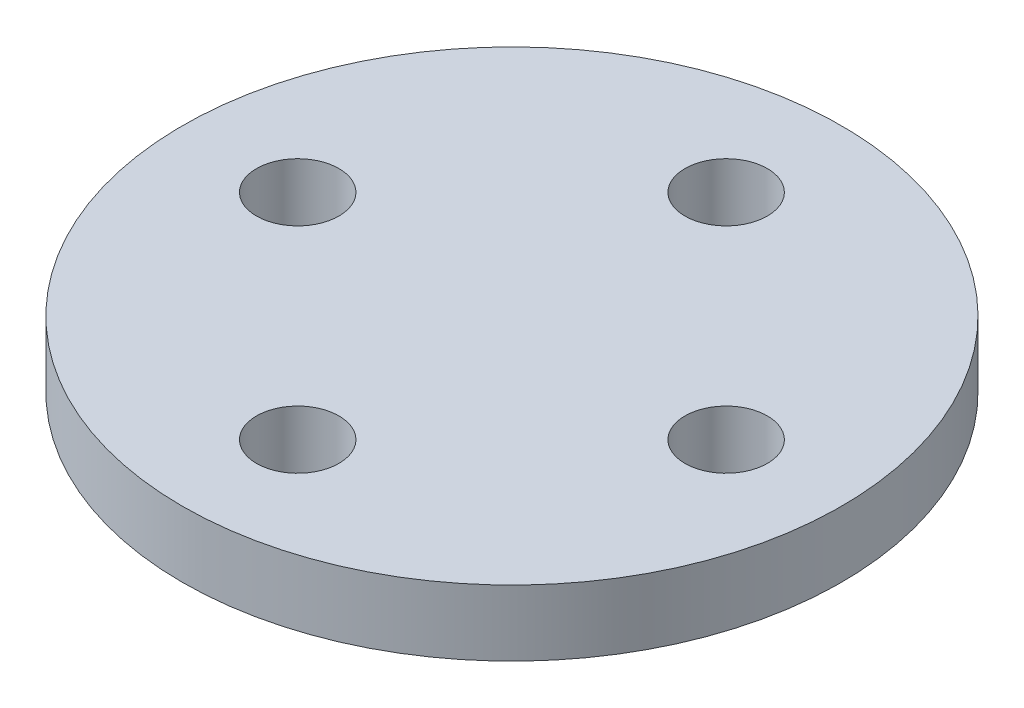
ISO-10303-21;
HEADER;
FILE_DESCRIPTION(('STEP AP214'),'2;1');
FILE_NAME('part.step','',(''),(''),'','','');
FILE_SCHEMA(('AUTOMOTIVE_DESIGN { 1 0 10303 214 1 1 1 1 }'));
ENDSEC;
DATA;
#1=APPLICATION_CONTEXT('core data for automotive mechanical design processes');
#2=APPLICATION_PROTOCOL_DEFINITION('international standard','automotive_design',2000,#1);
#3=PRODUCT_CONTEXT('',#1,'mechanical');
#4=PRODUCT('Part','Part','',(#3));
#5=PRODUCT_RELATED_PRODUCT_CATEGORY('part','',(#4));
#6=PRODUCT_DEFINITION_FORMATION('','',#4);
#7=PRODUCT_DEFINITION_CONTEXT('part definition',#1,'design');
#8=PRODUCT_DEFINITION('design','',#6,#7);
#9=PRODUCT_DEFINITION_SHAPE('','',#8);
#10=(LENGTH_UNIT() NAMED_UNIT(*) SI_UNIT(.MILLI.,.METRE.));
#11=(NAMED_UNIT(*) PLANE_ANGLE_UNIT() SI_UNIT($,.RADIAN.));
#12=(NAMED_UNIT(*) SI_UNIT($,.STERADIAN.) SOLID_ANGLE_UNIT());
#13=UNCERTAINTY_MEASURE_WITH_UNIT(LENGTH_MEASURE(1.E-05),#10,'distance_accuracy_value','');
#14=(GEOMETRIC_REPRESENTATION_CONTEXT(3) GLOBAL_UNCERTAINTY_ASSIGNED_CONTEXT((#13)) GLOBAL_UNIT_ASSIGNED_CONTEXT((#10,
#11,#12)) REPRESENTATION_CONTEXT('',''));
#15=CARTESIAN_POINT('',(0.,0.,0.));
#16=DIRECTION('',(0.,0.,1.));
#17=DIRECTION('',(1.,0.,0.));
#18=AXIS2_PLACEMENT_3D('',#15,#16,#17);
#19=CARTESIAN_POINT('',(0.,2.,0.));
#20=DIRECTION('',(0.,1.,0.));
#21=DIRECTION('',(0.,0.,1.));
#22=AXIS2_PLACEMENT_3D('',#19,#20,#21);
#23=PLANE('',#22);
#24=CARTESIAN_POINT('',(-2.8796409701215E-13,2.,6.50000000000009));
#25=DIRECTION('',(0.,1.,0.));
#26=DIRECTION('',(0.,0.,1.));
#27=AXIS2_PLACEMENT_3D('',#24,#25,#26);
#28=CIRCLE('',#27,1.24999999999974);
#29=CARTESIAN_POINT('',(-2.8796409701215E-13,2.,7.74999999999983));
#30=VERTEX_POINT('',#29);
#31=EDGE_CURVE('E61',#30,#30,#28,.T.);
#32=ORIENTED_EDGE('',*,*,#31,.F.);
#33=EDGE_LOOP('',(#32));
#34=FACE_BOUND('',#33,.T.);
#35=CARTESIAN_POINT('',(0.,2.,-6.5));
#36=DIRECTION('',(0.,1.,0.));
#37=DIRECTION('',(0.,0.,1.));
#38=AXIS2_PLACEMENT_3D('',#35,#36,#37);
#39=CIRCLE('',#38,1.25);
#40=CARTESIAN_POINT('',(0.,2.,-5.25));
#41=VERTEX_POINT('',#40);
#42=EDGE_CURVE('E73',#41,#41,#39,.T.);
#43=ORIENTED_EDGE('',*,*,#42,.F.);
#44=EDGE_LOOP('',(#43));
#45=FACE_BOUND('',#44,.T.);
#46=CARTESIAN_POINT('',(0.,2.,0.));
#47=DIRECTION('',(0.,1.,0.));
#48=DIRECTION('',(0.,0.,1.));
#49=AXIS2_PLACEMENT_3D('',#46,#47,#48);
#50=CIRCLE('',#49,10.);
#51=CARTESIAN_POINT('',(0.,2.,10.));
#52=VERTEX_POINT('',#51);
#53=EDGE_CURVE('E45',#52,#52,#50,.T.);
#54=ORIENTED_EDGE('',*,*,#53,.T.);
#55=EDGE_LOOP('',(#54));
#56=FACE_BOUND('',#55,.T.);
#57=CARTESIAN_POINT('',(6.49999999999971,2.,0.));
#58=DIRECTION('',(0.,1.,0.));
#59=DIRECTION('',(0.,0.,1.));
#60=AXIS2_PLACEMENT_3D('',#57,#58,#59);
#61=CIRCLE('',#60,1.25000000000002);
#62=CARTESIAN_POINT('',(6.49999999999971,2.,1.25000000000011));
#63=VERTEX_POINT('',#62);
#64=EDGE_CURVE('E67',#63,#63,#61,.T.);
#65=ORIENTED_EDGE('',*,*,#64,.F.);
#66=EDGE_LOOP('',(#65));
#67=FACE_BOUND('',#66,.T.);
#68=CARTESIAN_POINT('',(-6.5,2.,3.68853642922431E-13));
#69=DIRECTION('',(0.,1.,0.));
#70=DIRECTION('',(0.,0.,1.));
#71=AXIS2_PLACEMENT_3D('',#68,#69,#70);
#72=CIRCLE('',#71,1.25000000000042);
#73=CARTESIAN_POINT('',(-6.5,2.,1.25000000000079));
#74=VERTEX_POINT('',#73);
#75=EDGE_CURVE('E54',#74,#74,#72,.T.);
#76=ORIENTED_EDGE('',*,*,#75,.F.);
#77=EDGE_LOOP('',(#76));
#78=FACE_BOUND('',#77,.T.);
#79=ADVANCED_FACE('F37',(#34,#45,#56,#67,#78),#23,.T.);
#80=CARTESIAN_POINT('',(0.,0.,0.));
#81=DIRECTION('',(0.,1.,0.));
#82=DIRECTION('',(0.,0.,1.));
#83=AXIS2_PLACEMENT_3D('',#80,#81,#82);
#84=PLANE('',#83);
#85=CARTESIAN_POINT('',(0.,0.,0.));
#86=DIRECTION('',(0.,-1.,0.));
#87=DIRECTION('',(0.,0.,-1.));
#88=AXIS2_PLACEMENT_3D('',#85,#86,#87);
#89=CIRCLE('',#88,4.5);
#90=CARTESIAN_POINT('',(0.,0.,-4.5));
#91=VERTEX_POINT('',#90);
#92=EDGE_CURVE('E10',#91,#91,#89,.T.);
#93=ORIENTED_EDGE('',*,*,#92,.F.);
#94=EDGE_LOOP('',(#93));
#95=FACE_BOUND('',#94,.T.);
#96=CARTESIAN_POINT('',(0.,0.,0.));
#97=DIRECTION('',(0.,1.,0.));
#98=DIRECTION('',(0.,0.,1.));
#99=AXIS2_PLACEMENT_3D('',#96,#97,#98);
#100=CIRCLE('',#99,10.);
#101=CARTESIAN_POINT('',(0.,0.,10.));
#102=VERTEX_POINT('',#101);
#103=EDGE_CURVE('E41',#102,#102,#100,.T.);
#104=ORIENTED_EDGE('',*,*,#103,.F.);
#105=EDGE_LOOP('',(#104));
#106=FACE_BOUND('',#105,.T.);
#107=CARTESIAN_POINT('',(0.,0.,-6.5));
#108=DIRECTION('',(0.,1.,0.));
#109=DIRECTION('',(0.,0.,1.));
#110=AXIS2_PLACEMENT_3D('',#107,#108,#109);
#111=CIRCLE('',#110,1.25);
#112=CARTESIAN_POINT('',(0.,0.,-5.25));
#113=VERTEX_POINT('',#112);
#114=EDGE_CURVE('E70',#113,#113,#111,.T.);
#115=ORIENTED_EDGE('',*,*,#114,.T.);
#116=EDGE_LOOP('',(#115));
#117=FACE_BOUND('',#116,.T.);
#118=CARTESIAN_POINT('',(6.49999999999971,0.,0.));
#119=DIRECTION('',(0.,1.,0.));
#120=DIRECTION('',(0.,0.,1.));
#121=AXIS2_PLACEMENT_3D('',#118,#119,#120);
#122=CIRCLE('',#121,1.25000000000002);
#123=CARTESIAN_POINT('',(6.49999999999971,0.,1.25000000000011));
#124=VERTEX_POINT('',#123);
#125=EDGE_CURVE('E64',#124,#124,#122,.T.);
#126=ORIENTED_EDGE('',*,*,#125,.T.);
#127=EDGE_LOOP('',(#126));
#128=FACE_BOUND('',#127,.T.);
#129=CARTESIAN_POINT('',(-2.8796409701215E-13,0.,6.50000000000009));
#130=DIRECTION('',(0.,1.,0.));
#131=DIRECTION('',(0.,0.,1.));
#132=AXIS2_PLACEMENT_3D('',#129,#130,#131);
#133=CIRCLE('',#132,1.24999999999974);
#134=CARTESIAN_POINT('',(-2.8796409701215E-13,0.,7.74999999999983));
#135=VERTEX_POINT('',#134);
#136=EDGE_CURVE('E57',#135,#135,#133,.T.);
#137=ORIENTED_EDGE('',*,*,#136,.T.);
#138=EDGE_LOOP('',(#137));
#139=FACE_BOUND('',#138,.T.);
#140=CARTESIAN_POINT('',(-6.5,0.,3.68853642922431E-13));
#141=DIRECTION('',(0.,1.,0.));
#142=DIRECTION('',(0.,0.,1.));
#143=AXIS2_PLACEMENT_3D('',#140,#141,#142);
#144=CIRCLE('',#143,1.25000000000042);
#145=CARTESIAN_POINT('',(-6.5,0.,1.25000000000079));
#146=VERTEX_POINT('',#145);
#147=EDGE_CURVE('E58',#146,#146,#144,.T.);
#148=ORIENTED_EDGE('',*,*,#147,.T.);
#149=EDGE_LOOP('',(#148));
#150=FACE_BOUND('',#149,.T.);
#151=ADVANCED_FACE('F79',(#95,#106,#117,#128,#139,#150),#84,.F.);
#152=CARTESIAN_POINT('',(0.,2.,0.));
#153=DIRECTION('',(0.,-1.,0.));
#154=DIRECTION('',(0.,0.,-1.));
#155=AXIS2_PLACEMENT_3D('',#152,#153,#154);
#156=CYLINDRICAL_SURFACE('',#155,10.);
#157=ORIENTED_EDGE('',*,*,#53,.F.);
#158=EDGE_LOOP('',(#157));
#159=FACE_BOUND('',#158,.T.);
#160=ORIENTED_EDGE('',*,*,#103,.T.);
#161=EDGE_LOOP('',(#160));
#162=FACE_BOUND('',#161,.T.);
#163=ADVANCED_FACE('F39',(#159,#162),#156,.T.);
#164=CARTESIAN_POINT('',(0.,2.,-6.5));
#165=DIRECTION('',(0.,-1.,0.));
#166=DIRECTION('',(0.,0.,-1.));
#167=AXIS2_PLACEMENT_3D('',#164,#165,#166);
#168=CYLINDRICAL_SURFACE('',#167,1.25);
#169=ORIENTED_EDGE('',*,*,#42,.T.);
#170=EDGE_LOOP('',(#169));
#171=FACE_BOUND('',#170,.T.);
#172=ORIENTED_EDGE('',*,*,#114,.F.);
#173=EDGE_LOOP('',(#172));
#174=FACE_BOUND('',#173,.T.);
#175=ADVANCED_FACE('F82',(#171,#174),#168,.F.);
#176=CARTESIAN_POINT('',(6.49999999999971,2.,0.));
#177=DIRECTION('',(0.,-1.,0.));
#178=DIRECTION('',(0.,0.,-1.));
#179=AXIS2_PLACEMENT_3D('',#176,#177,#178);
#180=CYLINDRICAL_SURFACE('',#179,1.25000000000002);
#181=ORIENTED_EDGE('',*,*,#64,.T.);
#182=EDGE_LOOP('',(#181));
#183=FACE_BOUND('',#182,.T.);
#184=ORIENTED_EDGE('',*,*,#125,.F.);
#185=EDGE_LOOP('',(#184));
#186=FACE_BOUND('',#185,.T.);
#187=ADVANCED_FACE('F84',(#183,#186),#180,.F.);
#188=CARTESIAN_POINT('',(-2.8796409701215E-13,2.,6.50000000000009));
#189=DIRECTION('',(0.,-1.,0.));
#190=DIRECTION('',(0.,0.,-1.));
#191=AXIS2_PLACEMENT_3D('',#188,#189,#190);
#192=CYLINDRICAL_SURFACE('',#191,1.24999999999974);
#193=ORIENTED_EDGE('',*,*,#31,.T.);
#194=EDGE_LOOP('',(#193));
#195=FACE_BOUND('',#194,.T.);
#196=ORIENTED_EDGE('',*,*,#136,.F.);
#197=EDGE_LOOP('',(#196));
#198=FACE_BOUND('',#197,.T.);
#199=ADVANCED_FACE('F91',(#195,#198),#192,.F.);
#200=CARTESIAN_POINT('',(-6.5,2.,3.68853642922431E-13));
#201=DIRECTION('',(0.,-1.,0.));
#202=DIRECTION('',(0.,0.,-1.));
#203=AXIS2_PLACEMENT_3D('',#200,#201,#202);
#204=CYLINDRICAL_SURFACE('',#203,1.25000000000042);
#205=ORIENTED_EDGE('',*,*,#75,.T.);
#206=EDGE_LOOP('',(#205));
#207=FACE_BOUND('',#206,.T.);
#208=ORIENTED_EDGE('',*,*,#147,.F.);
#209=EDGE_LOOP('',(#208));
#210=FACE_BOUND('',#209,.T.);
#211=ADVANCED_FACE('F112',(#207,#210),#204,.F.);
#212=CARTESIAN_POINT('',(0.,-2.,0.));
#213=DIRECTION('',(0.,1.,0.));
#214=DIRECTION('',(0.,0.,1.));
#215=AXIS2_PLACEMENT_3D('',#212,#213,#214);
#216=CYLINDRICAL_SURFACE('',#215,4.5);
#217=CARTESIAN_POINT('',(0.,-2.,0.));
#218=DIRECTION('',(0.,-1.,0.));
#219=DIRECTION('',(0.,0.,-1.));
#220=AXIS2_PLACEMENT_3D('',#217,#218,#219);
#221=CIRCLE('',#220,4.5);
#222=CARTESIAN_POINT('',(0.,-2.,-4.5));
#223=VERTEX_POINT('',#222);
#224=EDGE_CURVE('E52',#223,#223,#221,.T.);
#225=ORIENTED_EDGE('',*,*,#224,.F.);
#226=EDGE_LOOP('',(#225));
#227=FACE_BOUND('',#226,.T.);
#228=ORIENTED_EDGE('',*,*,#92,.T.);
#229=EDGE_LOOP('',(#228));
#230=FACE_BOUND('',#229,.T.);
#231=ADVANCED_FACE('F115',(#227,#230),#216,.T.);
#232=CARTESIAN_POINT('',(0.,-2.,0.));
#233=DIRECTION('',(0.,-1.,0.));
#234=DIRECTION('',(0.,0.,-1.));
#235=AXIS2_PLACEMENT_3D('',#232,#233,#234);
#236=PLANE('',#235);
#237=CARTESIAN_POINT('',(0.,-2.,0.));
#238=DIRECTION('',(0.,-1.,0.));
#239=DIRECTION('',(0.,0.,-1.));
#240=AXIS2_PLACEMENT_3D('',#237,#238,#239);
#241=CIRCLE('',#240,2.5);
#242=CARTESIAN_POINT('',(0.,-2.,-2.5));
#243=VERTEX_POINT('',#242);
#244=EDGE_CURVE('E144',#243,#243,#241,.T.);
#245=ORIENTED_EDGE('',*,*,#244,.F.);
#246=EDGE_LOOP('',(#245));
#247=FACE_BOUND('',#246,.T.);
#248=ORIENTED_EDGE('',*,*,#224,.T.);
#249=EDGE_LOOP('',(#248));
#250=FACE_BOUND('',#249,.T.);
#251=ADVANCED_FACE('F123',(#247,#250),#236,.T.);
#252=CARTESIAN_POINT('',(0.,0.,0.));
#253=DIRECTION('',(0.,-1.,0.));
#254=DIRECTION('',(0.,0.,-1.));
#255=AXIS2_PLACEMENT_3D('',#252,#253,#254);
#256=CYLINDRICAL_SURFACE('',#255,2.5);
#257=CARTESIAN_POINT('',(0.,0.,0.));
#258=DIRECTION('',(0.,-1.,0.));
#259=DIRECTION('',(0.,0.,-1.));
#260=AXIS2_PLACEMENT_3D('',#257,#258,#259);
#261=CIRCLE('',#260,2.5);
#262=CARTESIAN_POINT('',(0.,0.,-2.5));
#263=VERTEX_POINT('',#262);
#264=EDGE_CURVE('E143',#263,#263,#261,.T.);
#265=ORIENTED_EDGE('',*,*,#264,.F.);
#266=EDGE_LOOP('',(#265));
#267=FACE_BOUND('',#266,.T.);
#268=ORIENTED_EDGE('',*,*,#244,.T.);
#269=EDGE_LOOP('',(#268));
#270=FACE_BOUND('',#269,.T.);
#271=ADVANCED_FACE('F131',(#267,#270),#256,.F.);
#272=CARTESIAN_POINT('',(0.,0.,0.));
#273=DIRECTION('',(0.,-1.,0.));
#274=DIRECTION('',(0.,0.,-1.));
#275=AXIS2_PLACEMENT_3D('',#272,#273,#274);
#276=PLANE('',#275);
#277=ORIENTED_EDGE('',*,*,#264,.T.);
#278=EDGE_LOOP('',(#277));
#279=FACE_BOUND('',#278,.T.);
#280=ADVANCED_FACE('F135',(#279),#276,.T.);
#281=CLOSED_SHELL('',(#79,#151,#163,#175,#187,#199,#211,#231,#251,#271,#280));
#282=MANIFOLD_SOLID_BREP('B2',#281);
#283=ADVANCED_BREP_SHAPE_REPRESENTATION('',(#18,#282),#14);
#284=SHAPE_DEFINITION_REPRESENTATION(#9,#283);
ENDSEC;
END-ISO-10303-21;
